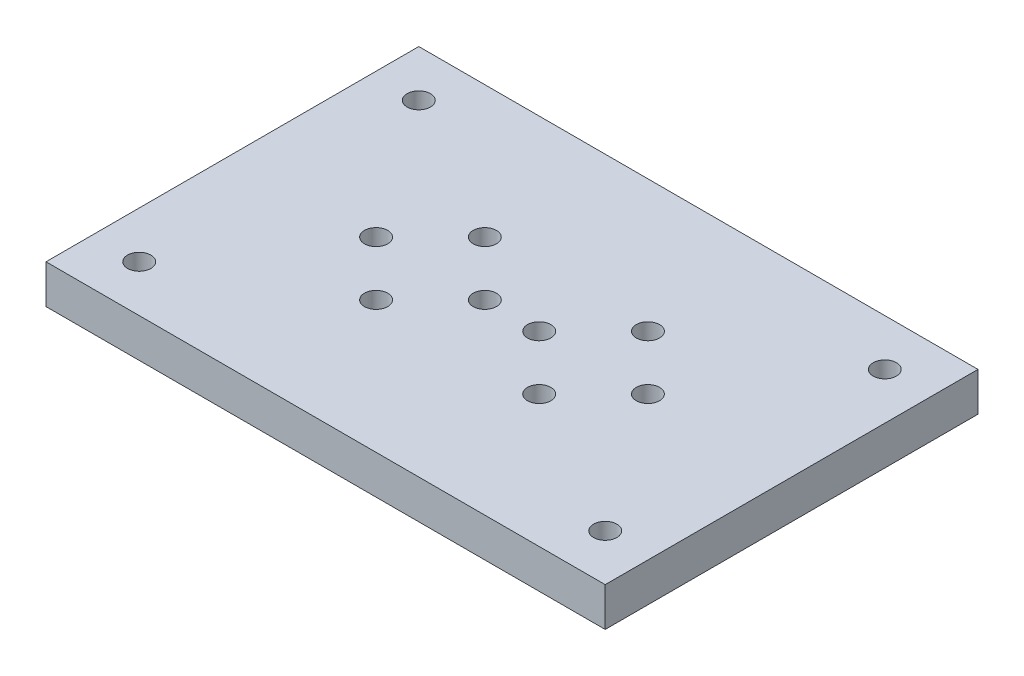
ISO-10303-21;
HEADER;
FILE_DESCRIPTION(('STEP AP214'),'2;1');
FILE_NAME('part.step','',(''),(''),'','','');
FILE_SCHEMA(('AUTOMOTIVE_DESIGN { 1 0 10303 214 1 1 1 1 }'));
ENDSEC;
DATA;
#1=APPLICATION_CONTEXT('core data for automotive mechanical design processes');
#2=APPLICATION_PROTOCOL_DEFINITION('international standard','automotive_design',2000,#1);
#3=PRODUCT_CONTEXT('',#1,'mechanical');
#4=PRODUCT('Part','Part','',(#3));
#5=PRODUCT_RELATED_PRODUCT_CATEGORY('part','',(#4));
#6=PRODUCT_DEFINITION_FORMATION('','',#4);
#7=PRODUCT_DEFINITION_CONTEXT('part definition',#1,'design');
#8=PRODUCT_DEFINITION('design','',#6,#7);
#9=PRODUCT_DEFINITION_SHAPE('','',#8);
#10=(LENGTH_UNIT() NAMED_UNIT(*) SI_UNIT(.MILLI.,.METRE.));
#11=(NAMED_UNIT(*) PLANE_ANGLE_UNIT() SI_UNIT($,.RADIAN.));
#12=(NAMED_UNIT(*) SI_UNIT($,.STERADIAN.) SOLID_ANGLE_UNIT());
#13=UNCERTAINTY_MEASURE_WITH_UNIT(LENGTH_MEASURE(1.E-05),#10,'distance_accuracy_value','');
#14=(GEOMETRIC_REPRESENTATION_CONTEXT(3) GLOBAL_UNCERTAINTY_ASSIGNED_CONTEXT((#13)) GLOBAL_UNIT_ASSIGNED_CONTEXT((#10,
#11,#12)) REPRESENTATION_CONTEXT('',''));
#15=CARTESIAN_POINT('',(0.,0.,0.));
#16=DIRECTION('',(0.,0.,1.));
#17=DIRECTION('',(1.,0.,0.));
#18=AXIS2_PLACEMENT_3D('',#15,#16,#17);
#19=CARTESIAN_POINT('',(0.,5.,0.));
#20=DIRECTION('',(0.,-1.,0.));
#21=DIRECTION('',(0.,0.,-1.));
#22=AXIS2_PLACEMENT_3D('',#19,#20,#21);
#23=PLANE('',#22);
#24=DIRECTION('',(0.,0.,-1.));
#25=VECTOR('',#24,1.);
#26=CARTESIAN_POINT('',(36.,5.,24.));
#27=LINE('',#26,#25);
#28=CARTESIAN_POINT('',(36.,5.,24.));
#29=VERTEX_POINT('',#28);
#30=CARTESIAN_POINT('',(36.,5.,-24.));
#31=VERTEX_POINT('',#30);
#32=EDGE_CURVE('E89',#29,#31,#27,.T.);
#33=ORIENTED_EDGE('',*,*,#32,.T.);
#34=DIRECTION('',(-1.,0.,0.));
#35=VECTOR('',#34,1.);
#36=CARTESIAN_POINT('',(-36.,5.,-24.));
#37=LINE('',#36,#35);
#38=CARTESIAN_POINT('',(-36.,5.,-24.));
#39=VERTEX_POINT('',#38);
#40=EDGE_CURVE('E84',#31,#39,#37,.T.);
#41=ORIENTED_EDGE('',*,*,#40,.T.);
#42=DIRECTION('',(0.,0.,1.));
#43=VECTOR('',#42,1.);
#44=CARTESIAN_POINT('',(-36.,5.,24.));
#45=LINE('',#44,#43);
#46=CARTESIAN_POINT('',(-36.,5.,24.));
#47=VERTEX_POINT('',#46);
#48=EDGE_CURVE('E87',#39,#47,#45,.T.);
#49=ORIENTED_EDGE('',*,*,#48,.T.);
#50=DIRECTION('',(1.,0.,0.));
#51=VECTOR('',#50,1.);
#52=CARTESIAN_POINT('',(-36.,5.,24.));
#53=LINE('',#52,#51);
#54=EDGE_CURVE('E54',#47,#29,#53,.T.);
#55=ORIENTED_EDGE('',*,*,#54,.T.);
#56=EDGE_LOOP('',(#33,#41,#49,#55));
#57=FACE_BOUND('',#56,.T.);
#58=CARTESIAN_POINT('',(-17.5,5.,0.));
#59=DIRECTION('',(0.,1.,0.));
#60=DIRECTION('',(0.,0.,1.));
#61=AXIS2_PLACEMENT_3D('',#58,#59,#60);
#62=CIRCLE('',#61,1.5);
#63=CARTESIAN_POINT('',(-17.5,5.,1.5));
#64=VERTEX_POINT('',#63);
#65=EDGE_CURVE('E104',#64,#64,#62,.T.);
#66=ORIENTED_EDGE('',*,*,#65,.F.);
#67=EDGE_LOOP('',(#66));
#68=FACE_BOUND('',#67,.T.);
#69=CARTESIAN_POINT('',(-30.,5.,18.));
#70=DIRECTION('',(0.,1.,0.));
#71=DIRECTION('',(0.,0.,1.));
#72=AXIS2_PLACEMENT_3D('',#69,#70,#71);
#73=CIRCLE('',#72,1.5);
#74=CARTESIAN_POINT('',(-30.,5.,19.5));
#75=VERTEX_POINT('',#74);
#76=EDGE_CURVE('E119',#75,#75,#73,.T.);
#77=ORIENTED_EDGE('',*,*,#76,.F.);
#78=EDGE_LOOP('',(#77));
#79=FACE_BOUND('',#78,.T.);
#80=CARTESIAN_POINT('',(-10.5,5.,-7.));
#81=DIRECTION('',(0.,1.,0.));
#82=DIRECTION('',(0.,0.,1.));
#83=AXIS2_PLACEMENT_3D('',#80,#81,#82);
#84=CIRCLE('',#83,1.5);
#85=CARTESIAN_POINT('',(-10.5,5.,-5.5));
#86=VERTEX_POINT('',#85);
#87=EDGE_CURVE('E125',#86,#86,#84,.T.);
#88=ORIENTED_EDGE('',*,*,#87,.F.);
#89=EDGE_LOOP('',(#88));
#90=FACE_BOUND('',#89,.T.);
#91=CARTESIAN_POINT('',(-3.5,5.,0.));
#92=DIRECTION('',(0.,1.,0.));
#93=DIRECTION('',(0.,0.,1.));
#94=AXIS2_PLACEMENT_3D('',#91,#92,#93);
#95=CIRCLE('',#94,1.5);
#96=CARTESIAN_POINT('',(-3.5,5.,1.5));
#97=VERTEX_POINT('',#96);
#98=EDGE_CURVE('E131',#97,#97,#95,.T.);
#99=ORIENTED_EDGE('',*,*,#98,.F.);
#100=EDGE_LOOP('',(#99));
#101=FACE_BOUND('',#100,.T.);
#102=CARTESIAN_POINT('',(-10.5,5.,7.));
#103=DIRECTION('',(0.,1.,0.));
#104=DIRECTION('',(0.,0.,1.));
#105=AXIS2_PLACEMENT_3D('',#102,#103,#104);
#106=CIRCLE('',#105,1.5);
#107=CARTESIAN_POINT('',(-10.5,5.,8.49999999999999));
#108=VERTEX_POINT('',#107);
#109=EDGE_CURVE('E137',#108,#108,#106,.T.);
#110=ORIENTED_EDGE('',*,*,#109,.F.);
#111=EDGE_LOOP('',(#110));
#112=FACE_BOUND('',#111,.T.);
#113=CARTESIAN_POINT('',(-30.,5.,-18.));
#114=DIRECTION('',(0.,1.,0.));
#115=DIRECTION('',(0.,0.,1.));
#116=AXIS2_PLACEMENT_3D('',#113,#114,#115);
#117=CIRCLE('',#116,1.5);
#118=CARTESIAN_POINT('',(-30.,5.,-16.5));
#119=VERTEX_POINT('',#118);
#120=EDGE_CURVE('E143',#119,#119,#117,.T.);
#121=ORIENTED_EDGE('',*,*,#120,.F.);
#122=EDGE_LOOP('',(#121));
#123=FACE_BOUND('',#122,.T.);
#124=CARTESIAN_POINT('',(10.5,5.,-7.));
#125=DIRECTION('',(0.,1.,0.));
#126=DIRECTION('',(0.,0.,-1.));
#127=AXIS2_PLACEMENT_3D('',#124,#125,#126);
#128=CIRCLE('',#127,1.5);
#129=CARTESIAN_POINT('',(10.5,5.,-8.49999999999999));
#130=VERTEX_POINT('',#129);
#131=EDGE_CURVE('E149',#130,#130,#128,.T.);
#132=ORIENTED_EDGE('',*,*,#131,.F.);
#133=EDGE_LOOP('',(#132));
#134=FACE_BOUND('',#133,.T.);
#135=CARTESIAN_POINT('',(3.5,5.,0.));
#136=DIRECTION('',(0.,1.,0.));
#137=DIRECTION('',(0.,0.,-1.));
#138=AXIS2_PLACEMENT_3D('',#135,#136,#137);
#139=CIRCLE('',#138,1.5);
#140=CARTESIAN_POINT('',(3.5,5.,-1.5));
#141=VERTEX_POINT('',#140);
#142=EDGE_CURVE('E155',#141,#141,#139,.T.);
#143=ORIENTED_EDGE('',*,*,#142,.F.);
#144=EDGE_LOOP('',(#143));
#145=FACE_BOUND('',#144,.T.);
#146=CARTESIAN_POINT('',(10.5,5.,7.));
#147=DIRECTION('',(0.,1.,0.));
#148=DIRECTION('',(0.,0.,-1.));
#149=AXIS2_PLACEMENT_3D('',#146,#147,#148);
#150=CIRCLE('',#149,1.5);
#151=CARTESIAN_POINT('',(10.5,5.,5.5));
#152=VERTEX_POINT('',#151);
#153=EDGE_CURVE('E161',#152,#152,#150,.T.);
#154=ORIENTED_EDGE('',*,*,#153,.F.);
#155=EDGE_LOOP('',(#154));
#156=FACE_BOUND('',#155,.T.);
#157=CARTESIAN_POINT('',(17.5,5.,0.));
#158=DIRECTION('',(0.,1.,0.));
#159=DIRECTION('',(0.,0.,-1.));
#160=AXIS2_PLACEMENT_3D('',#157,#158,#159);
#161=CIRCLE('',#160,1.5);
#162=CARTESIAN_POINT('',(17.5,5.,-1.5));
#163=VERTEX_POINT('',#162);
#164=EDGE_CURVE('E167',#163,#163,#161,.T.);
#165=ORIENTED_EDGE('',*,*,#164,.F.);
#166=EDGE_LOOP('',(#165));
#167=FACE_BOUND('',#166,.T.);
#168=CARTESIAN_POINT('',(30.,5.,-18.));
#169=DIRECTION('',(0.,1.,0.));
#170=DIRECTION('',(0.,0.,-1.));
#171=AXIS2_PLACEMENT_3D('',#168,#169,#170);
#172=CIRCLE('',#171,1.5);
#173=CARTESIAN_POINT('',(30.,5.,-19.5));
#174=VERTEX_POINT('',#173);
#175=EDGE_CURVE('E173',#174,#174,#172,.T.);
#176=ORIENTED_EDGE('',*,*,#175,.F.);
#177=EDGE_LOOP('',(#176));
#178=FACE_BOUND('',#177,.T.);
#179=CARTESIAN_POINT('',(30.,5.,18.));
#180=DIRECTION('',(0.,1.,0.));
#181=DIRECTION('',(0.,0.,-1.));
#182=AXIS2_PLACEMENT_3D('',#179,#180,#181);
#183=CIRCLE('',#182,1.5);
#184=CARTESIAN_POINT('',(30.,5.,16.5));
#185=VERTEX_POINT('',#184);
#186=EDGE_CURVE('E179',#185,#185,#183,.T.);
#187=ORIENTED_EDGE('',*,*,#186,.F.);
#188=EDGE_LOOP('',(#187));
#189=FACE_BOUND('',#188,.T.);
#190=ADVANCED_FACE('F37',(#57,#68,#79,#90,#101,#112,#123,#134,#145,#156,#167,#178,#189),#23,.F.);
#191=CARTESIAN_POINT('',(0.,0.,0.));
#192=DIRECTION('',(0.,-1.,0.));
#193=DIRECTION('',(0.,0.,-1.));
#194=AXIS2_PLACEMENT_3D('',#191,#192,#193);
#195=PLANE('',#194);
#196=CARTESIAN_POINT('',(30.,0.,-18.));
#197=DIRECTION('',(0.,1.,0.));
#198=DIRECTION('',(0.,0.,-1.));
#199=AXIS2_PLACEMENT_3D('',#196,#197,#198);
#200=CIRCLE('',#199,1.5);
#201=CARTESIAN_POINT('',(30.,0.,-19.5));
#202=VERTEX_POINT('',#201);
#203=EDGE_CURVE('E176',#202,#202,#200,.T.);
#204=ORIENTED_EDGE('',*,*,#203,.T.);
#205=EDGE_LOOP('',(#204));
#206=FACE_BOUND('',#205,.T.);
#207=CARTESIAN_POINT('',(10.5,0.,7.));
#208=DIRECTION('',(0.,1.,0.));
#209=DIRECTION('',(0.,0.,-1.));
#210=AXIS2_PLACEMENT_3D('',#207,#208,#209);
#211=CIRCLE('',#210,1.5);
#212=CARTESIAN_POINT('',(10.5,0.,5.5));
#213=VERTEX_POINT('',#212);
#214=EDGE_CURVE('E164',#213,#213,#211,.T.);
#215=ORIENTED_EDGE('',*,*,#214,.T.);
#216=EDGE_LOOP('',(#215));
#217=FACE_BOUND('',#216,.T.);
#218=CARTESIAN_POINT('',(10.5,0.,-7.));
#219=DIRECTION('',(0.,1.,0.));
#220=DIRECTION('',(0.,0.,-1.));
#221=AXIS2_PLACEMENT_3D('',#218,#219,#220);
#222=CIRCLE('',#221,1.5);
#223=CARTESIAN_POINT('',(10.5,0.,-8.49999999999999));
#224=VERTEX_POINT('',#223);
#225=EDGE_CURVE('E152',#224,#224,#222,.T.);
#226=ORIENTED_EDGE('',*,*,#225,.T.);
#227=EDGE_LOOP('',(#226));
#228=FACE_BOUND('',#227,.T.);
#229=CARTESIAN_POINT('',(-10.5,0.,7.));
#230=DIRECTION('',(0.,1.,0.));
#231=DIRECTION('',(0.,0.,1.));
#232=AXIS2_PLACEMENT_3D('',#229,#230,#231);
#233=CIRCLE('',#232,1.5);
#234=CARTESIAN_POINT('',(-10.5,0.,8.49999999999999));
#235=VERTEX_POINT('',#234);
#236=EDGE_CURVE('E140',#235,#235,#233,.T.);
#237=ORIENTED_EDGE('',*,*,#236,.T.);
#238=EDGE_LOOP('',(#237));
#239=FACE_BOUND('',#238,.T.);
#240=CARTESIAN_POINT('',(-10.5,0.,-7.));
#241=DIRECTION('',(0.,1.,0.));
#242=DIRECTION('',(0.,0.,1.));
#243=AXIS2_PLACEMENT_3D('',#240,#241,#242);
#244=CIRCLE('',#243,1.5);
#245=CARTESIAN_POINT('',(-10.5,0.,-5.5));
#246=VERTEX_POINT('',#245);
#247=EDGE_CURVE('E128',#246,#246,#244,.T.);
#248=ORIENTED_EDGE('',*,*,#247,.T.);
#249=EDGE_LOOP('',(#248));
#250=FACE_BOUND('',#249,.T.);
#251=CARTESIAN_POINT('',(-17.5,0.,0.));
#252=DIRECTION('',(0.,1.,0.));
#253=DIRECTION('',(0.,0.,1.));
#254=AXIS2_PLACEMENT_3D('',#251,#252,#253);
#255=CIRCLE('',#254,1.5);
#256=CARTESIAN_POINT('',(-17.5,0.,1.5));
#257=VERTEX_POINT('',#256);
#258=EDGE_CURVE('E116',#257,#257,#255,.T.);
#259=ORIENTED_EDGE('',*,*,#258,.T.);
#260=EDGE_LOOP('',(#259));
#261=FACE_BOUND('',#260,.T.);
#262=DIRECTION('',(0.,0.,-1.));
#263=VECTOR('',#262,1.);
#264=CARTESIAN_POINT('',(36.,0.,24.));
#265=LINE('',#264,#263);
#266=CARTESIAN_POINT('',(36.,0.,24.));
#267=VERTEX_POINT('',#266);
#268=CARTESIAN_POINT('',(36.,0.,-24.));
#269=VERTEX_POINT('',#268);
#270=EDGE_CURVE('E101',#267,#269,#265,.T.);
#271=ORIENTED_EDGE('',*,*,#270,.F.);
#272=DIRECTION('',(1.,0.,0.));
#273=VECTOR('',#272,1.);
#274=CARTESIAN_POINT('',(-36.,0.,24.));
#275=LINE('',#274,#273);
#276=CARTESIAN_POINT('',(-36.,0.,24.));
#277=VERTEX_POINT('',#276);
#278=EDGE_CURVE('E77',#277,#267,#275,.T.);
#279=ORIENTED_EDGE('',*,*,#278,.F.);
#280=DIRECTION('',(0.,0.,1.));
#281=VECTOR('',#280,1.);
#282=CARTESIAN_POINT('',(-36.,0.,24.));
#283=LINE('',#282,#281);
#284=CARTESIAN_POINT('',(-36.,0.,-24.));
#285=VERTEX_POINT('',#284);
#286=EDGE_CURVE('E71',#285,#277,#283,.T.);
#287=ORIENTED_EDGE('',*,*,#286,.F.);
#288=DIRECTION('',(-1.,0.,0.));
#289=VECTOR('',#288,1.);
#290=CARTESIAN_POINT('',(-36.,0.,-24.));
#291=LINE('',#290,#289);
#292=EDGE_CURVE('E93',#269,#285,#291,.T.);
#293=ORIENTED_EDGE('',*,*,#292,.F.);
#294=EDGE_LOOP('',(#271,#279,#287,#293));
#295=FACE_BOUND('',#294,.T.);
#296=CARTESIAN_POINT('',(-30.,0.,18.));
#297=DIRECTION('',(0.,1.,0.));
#298=DIRECTION('',(0.,0.,1.));
#299=AXIS2_PLACEMENT_3D('',#296,#297,#298);
#300=CIRCLE('',#299,1.5);
#301=CARTESIAN_POINT('',(-30.,0.,19.5));
#302=VERTEX_POINT('',#301);
#303=EDGE_CURVE('E122',#302,#302,#300,.T.);
#304=ORIENTED_EDGE('',*,*,#303,.T.);
#305=EDGE_LOOP('',(#304));
#306=FACE_BOUND('',#305,.T.);
#307=CARTESIAN_POINT('',(-3.5,0.,0.));
#308=DIRECTION('',(0.,1.,0.));
#309=DIRECTION('',(0.,0.,1.));
#310=AXIS2_PLACEMENT_3D('',#307,#308,#309);
#311=CIRCLE('',#310,1.5);
#312=CARTESIAN_POINT('',(-3.5,0.,1.5));
#313=VERTEX_POINT('',#312);
#314=EDGE_CURVE('E134',#313,#313,#311,.T.);
#315=ORIENTED_EDGE('',*,*,#314,.T.);
#316=EDGE_LOOP('',(#315));
#317=FACE_BOUND('',#316,.T.);
#318=CARTESIAN_POINT('',(-30.,0.,-18.));
#319=DIRECTION('',(0.,1.,0.));
#320=DIRECTION('',(0.,0.,1.));
#321=AXIS2_PLACEMENT_3D('',#318,#319,#320);
#322=CIRCLE('',#321,1.5);
#323=CARTESIAN_POINT('',(-30.,0.,-16.5));
#324=VERTEX_POINT('',#323);
#325=EDGE_CURVE('E146',#324,#324,#322,.T.);
#326=ORIENTED_EDGE('',*,*,#325,.T.);
#327=EDGE_LOOP('',(#326));
#328=FACE_BOUND('',#327,.T.);
#329=CARTESIAN_POINT('',(3.5,0.,0.));
#330=DIRECTION('',(0.,1.,0.));
#331=DIRECTION('',(0.,0.,-1.));
#332=AXIS2_PLACEMENT_3D('',#329,#330,#331);
#333=CIRCLE('',#332,1.5);
#334=CARTESIAN_POINT('',(3.5,0.,-1.5));
#335=VERTEX_POINT('',#334);
#336=EDGE_CURVE('E158',#335,#335,#333,.T.);
#337=ORIENTED_EDGE('',*,*,#336,.T.);
#338=EDGE_LOOP('',(#337));
#339=FACE_BOUND('',#338,.T.);
#340=CARTESIAN_POINT('',(17.5,0.,0.));
#341=DIRECTION('',(0.,1.,0.));
#342=DIRECTION('',(0.,0.,-1.));
#343=AXIS2_PLACEMENT_3D('',#340,#341,#342);
#344=CIRCLE('',#343,1.5);
#345=CARTESIAN_POINT('',(17.5,0.,-1.5));
#346=VERTEX_POINT('',#345);
#347=EDGE_CURVE('E170',#346,#346,#344,.T.);
#348=ORIENTED_EDGE('',*,*,#347,.T.);
#349=EDGE_LOOP('',(#348));
#350=FACE_BOUND('',#349,.T.);
#351=CARTESIAN_POINT('',(30.,0.,18.));
#352=DIRECTION('',(0.,1.,0.));
#353=DIRECTION('',(0.,0.,-1.));
#354=AXIS2_PLACEMENT_3D('',#351,#352,#353);
#355=CIRCLE('',#354,1.5);
#356=CARTESIAN_POINT('',(30.,0.,16.5));
#357=VERTEX_POINT('',#356);
#358=EDGE_CURVE('E182',#357,#357,#355,.T.);
#359=ORIENTED_EDGE('',*,*,#358,.T.);
#360=EDGE_LOOP('',(#359));
#361=FACE_BOUND('',#360,.T.);
#362=ADVANCED_FACE('F112',(#206,#217,#228,#239,#250,#261,#295,#306,#317,#328,#339,#350,#361),
#195,.T.);
#363=CARTESIAN_POINT('',(36.,5.,24.));
#364=DIRECTION('',(-1.,0.,0.));
#365=DIRECTION('',(0.,0.,1.));
#366=AXIS2_PLACEMENT_3D('',#363,#364,#365);
#367=PLANE('',#366);
#368=ORIENTED_EDGE('',*,*,#270,.T.);
#369=DIRECTION('',(0.,-1.,0.));
#370=VECTOR('',#369,1.);
#371=CARTESIAN_POINT('',(36.,5.,-24.));
#372=LINE('',#371,#370);
#373=EDGE_CURVE('E11',#31,#269,#372,.T.);
#374=ORIENTED_EDGE('',*,*,#373,.F.);
#375=ORIENTED_EDGE('',*,*,#32,.F.);
#376=DIRECTION('',(0.,-1.,0.));
#377=VECTOR('',#376,1.);
#378=CARTESIAN_POINT('',(36.,5.,24.));
#379=LINE('',#378,#377);
#380=EDGE_CURVE('E97',#29,#267,#379,.T.);
#381=ORIENTED_EDGE('',*,*,#380,.T.);
#382=EDGE_LOOP('',(#368,#374,#375,#381));
#383=FACE_BOUND('',#382,.T.);
#384=ADVANCED_FACE('F39',(#383),#367,.F.);
#385=CARTESIAN_POINT('',(-36.,5.,-24.));
#386=DIRECTION('',(0.,0.,1.));
#387=DIRECTION('',(1.,0.,0.));
#388=AXIS2_PLACEMENT_3D('',#385,#386,#387);
#389=PLANE('',#388);
#390=ORIENTED_EDGE('',*,*,#292,.T.);
#391=DIRECTION('',(0.,-1.,0.));
#392=VECTOR('',#391,1.);
#393=CARTESIAN_POINT('',(-36.,5.,-24.));
#394=LINE('',#393,#392);
#395=EDGE_CURVE('E46',#39,#285,#394,.T.);
#396=ORIENTED_EDGE('',*,*,#395,.F.);
#397=ORIENTED_EDGE('',*,*,#40,.F.);
#398=ORIENTED_EDGE('',*,*,#373,.T.);
#399=EDGE_LOOP('',(#390,#396,#397,#398));
#400=FACE_BOUND('',#399,.T.);
#401=ADVANCED_FACE('F92',(#400),#389,.F.);
#402=CARTESIAN_POINT('',(-36.,5.,24.));
#403=DIRECTION('',(1.,0.,0.));
#404=DIRECTION('',(0.,0.,-1.));
#405=AXIS2_PLACEMENT_3D('',#402,#403,#404);
#406=PLANE('',#405);
#407=ORIENTED_EDGE('',*,*,#286,.T.);
#408=DIRECTION('',(0.,-1.,0.));
#409=VECTOR('',#408,1.);
#410=CARTESIAN_POINT('',(-36.,5.,24.));
#411=LINE('',#410,#409);
#412=EDGE_CURVE('E94',#47,#277,#411,.T.);
#413=ORIENTED_EDGE('',*,*,#412,.F.);
#414=ORIENTED_EDGE('',*,*,#48,.F.);
#415=ORIENTED_EDGE('',*,*,#395,.T.);
#416=EDGE_LOOP('',(#407,#413,#414,#415));
#417=FACE_BOUND('',#416,.T.);
#418=ADVANCED_FACE('F95',(#417),#406,.F.);
#419=CARTESIAN_POINT('',(-36.,5.,24.));
#420=DIRECTION('',(0.,0.,-1.));
#421=DIRECTION('',(-1.,0.,0.));
#422=AXIS2_PLACEMENT_3D('',#419,#420,#421);
#423=PLANE('',#422);
#424=ORIENTED_EDGE('',*,*,#278,.T.);
#425=ORIENTED_EDGE('',*,*,#380,.F.);
#426=ORIENTED_EDGE('',*,*,#54,.F.);
#427=ORIENTED_EDGE('',*,*,#412,.T.);
#428=EDGE_LOOP('',(#424,#425,#426,#427));
#429=FACE_BOUND('',#428,.T.);
#430=ADVANCED_FACE('F109',(#429),#423,.F.);
#431=CARTESIAN_POINT('',(-17.5,5.,0.));
#432=DIRECTION('',(0.,-1.,0.));
#433=DIRECTION('',(0.,0.,-1.));
#434=AXIS2_PLACEMENT_3D('',#431,#432,#433);
#435=CYLINDRICAL_SURFACE('',#434,1.5);
#436=ORIENTED_EDGE('',*,*,#65,.T.);
#437=EDGE_LOOP('',(#436));
#438=FACE_BOUND('',#437,.T.);
#439=ORIENTED_EDGE('',*,*,#258,.F.);
#440=EDGE_LOOP('',(#439));
#441=FACE_BOUND('',#440,.T.);
#442=ADVANCED_FACE('F199',(#438,#441),#435,.F.);
#443=CARTESIAN_POINT('',(-30.,5.,18.));
#444=DIRECTION('',(0.,-1.,0.));
#445=DIRECTION('',(0.,0.,-1.));
#446=AXIS2_PLACEMENT_3D('',#443,#444,#445);
#447=CYLINDRICAL_SURFACE('',#446,1.5);
#448=ORIENTED_EDGE('',*,*,#76,.T.);
#449=EDGE_LOOP('',(#448));
#450=FACE_BOUND('',#449,.T.);
#451=ORIENTED_EDGE('',*,*,#303,.F.);
#452=EDGE_LOOP('',(#451));
#453=FACE_BOUND('',#452,.T.);
#454=ADVANCED_FACE('F253',(#450,#453),#447,.F.);
#455=CARTESIAN_POINT('',(-10.5,5.,-7.));
#456=DIRECTION('',(0.,-1.,0.));
#457=DIRECTION('',(0.,0.,-1.));
#458=AXIS2_PLACEMENT_3D('',#455,#456,#457);
#459=CYLINDRICAL_SURFACE('',#458,1.5);
#460=ORIENTED_EDGE('',*,*,#87,.T.);
#461=EDGE_LOOP('',(#460));
#462=FACE_BOUND('',#461,.T.);
#463=ORIENTED_EDGE('',*,*,#247,.F.);
#464=EDGE_LOOP('',(#463));
#465=FACE_BOUND('',#464,.T.);
#466=ADVANCED_FACE('F262',(#462,#465),#459,.F.);
#467=CARTESIAN_POINT('',(-3.5,5.,0.));
#468=DIRECTION('',(0.,-1.,0.));
#469=DIRECTION('',(0.,0.,-1.));
#470=AXIS2_PLACEMENT_3D('',#467,#468,#469);
#471=CYLINDRICAL_SURFACE('',#470,1.5);
#472=ORIENTED_EDGE('',*,*,#98,.T.);
#473=EDGE_LOOP('',(#472));
#474=FACE_BOUND('',#473,.T.);
#475=ORIENTED_EDGE('',*,*,#314,.F.);
#476=EDGE_LOOP('',(#475));
#477=FACE_BOUND('',#476,.T.);
#478=ADVANCED_FACE('F271',(#474,#477),#471,.F.);
#479=CARTESIAN_POINT('',(-10.5,5.,7.));
#480=DIRECTION('',(0.,-1.,0.));
#481=DIRECTION('',(0.,0.,-1.));
#482=AXIS2_PLACEMENT_3D('',#479,#480,#481);
#483=CYLINDRICAL_SURFACE('',#482,1.5);
#484=ORIENTED_EDGE('',*,*,#109,.T.);
#485=EDGE_LOOP('',(#484));
#486=FACE_BOUND('',#485,.T.);
#487=ORIENTED_EDGE('',*,*,#236,.F.);
#488=EDGE_LOOP('',(#487));
#489=FACE_BOUND('',#488,.T.);
#490=ADVANCED_FACE('F281',(#486,#489),#483,.F.);
#491=CARTESIAN_POINT('',(-30.,5.,-18.));
#492=DIRECTION('',(0.,-1.,0.));
#493=DIRECTION('',(0.,0.,-1.));
#494=AXIS2_PLACEMENT_3D('',#491,#492,#493);
#495=CYLINDRICAL_SURFACE('',#494,1.5);
#496=ORIENTED_EDGE('',*,*,#120,.T.);
#497=EDGE_LOOP('',(#496));
#498=FACE_BOUND('',#497,.T.);
#499=ORIENTED_EDGE('',*,*,#325,.F.);
#500=EDGE_LOOP('',(#499));
#501=FACE_BOUND('',#500,.T.);
#502=ADVANCED_FACE('F291',(#498,#501),#495,.F.);
#503=CARTESIAN_POINT('',(10.5,5.,-7.));
#504=DIRECTION('',(0.,-1.,0.));
#505=DIRECTION('',(0.,0.,-1.));
#506=AXIS2_PLACEMENT_3D('',#503,#504,#505);
#507=CYLINDRICAL_SURFACE('',#506,1.5);
#508=ORIENTED_EDGE('',*,*,#131,.T.);
#509=EDGE_LOOP('',(#508));
#510=FACE_BOUND('',#509,.T.);
#511=ORIENTED_EDGE('',*,*,#225,.F.);
#512=EDGE_LOOP('',(#511));
#513=FACE_BOUND('',#512,.T.);
#514=ADVANCED_FACE('F301',(#510,#513),#507,.F.);
#515=CARTESIAN_POINT('',(3.5,5.,0.));
#516=DIRECTION('',(0.,-1.,0.));
#517=DIRECTION('',(0.,0.,-1.));
#518=AXIS2_PLACEMENT_3D('',#515,#516,#517);
#519=CYLINDRICAL_SURFACE('',#518,1.5);
#520=ORIENTED_EDGE('',*,*,#142,.T.);
#521=EDGE_LOOP('',(#520));
#522=FACE_BOUND('',#521,.T.);
#523=ORIENTED_EDGE('',*,*,#336,.F.);
#524=EDGE_LOOP('',(#523));
#525=FACE_BOUND('',#524,.T.);
#526=ADVANCED_FACE('F311',(#522,#525),#519,.F.);
#527=CARTESIAN_POINT('',(10.5,5.,7.));
#528=DIRECTION('',(0.,-1.,0.));
#529=DIRECTION('',(0.,0.,-1.));
#530=AXIS2_PLACEMENT_3D('',#527,#528,#529);
#531=CYLINDRICAL_SURFACE('',#530,1.5);
#532=ORIENTED_EDGE('',*,*,#153,.T.);
#533=EDGE_LOOP('',(#532));
#534=FACE_BOUND('',#533,.T.);
#535=ORIENTED_EDGE('',*,*,#214,.F.);
#536=EDGE_LOOP('',(#535));
#537=FACE_BOUND('',#536,.T.);
#538=ADVANCED_FACE('F321',(#534,#537),#531,.F.);
#539=CARTESIAN_POINT('',(17.5,5.,0.));
#540=DIRECTION('',(0.,-1.,0.));
#541=DIRECTION('',(0.,0.,-1.));
#542=AXIS2_PLACEMENT_3D('',#539,#540,#541);
#543=CYLINDRICAL_SURFACE('',#542,1.5);
#544=ORIENTED_EDGE('',*,*,#164,.T.);
#545=EDGE_LOOP('',(#544));
#546=FACE_BOUND('',#545,.T.);
#547=ORIENTED_EDGE('',*,*,#347,.F.);
#548=EDGE_LOOP('',(#547));
#549=FACE_BOUND('',#548,.T.);
#550=ADVANCED_FACE('F331',(#546,#549),#543,.F.);
#551=CARTESIAN_POINT('',(30.,5.,-18.));
#552=DIRECTION('',(0.,-1.,0.));
#553=DIRECTION('',(0.,0.,-1.));
#554=AXIS2_PLACEMENT_3D('',#551,#552,#553);
#555=CYLINDRICAL_SURFACE('',#554,1.5);
#556=ORIENTED_EDGE('',*,*,#175,.T.);
#557=EDGE_LOOP('',(#556));
#558=FACE_BOUND('',#557,.T.);
#559=ORIENTED_EDGE('',*,*,#203,.F.);
#560=EDGE_LOOP('',(#559));
#561=FACE_BOUND('',#560,.T.);
#562=ADVANCED_FACE('F341',(#558,#561),#555,.F.);
#563=CARTESIAN_POINT('',(30.,5.,18.));
#564=DIRECTION('',(0.,-1.,0.));
#565=DIRECTION('',(0.,0.,-1.));
#566=AXIS2_PLACEMENT_3D('',#563,#564,#565);
#567=CYLINDRICAL_SURFACE('',#566,1.5);
#568=ORIENTED_EDGE('',*,*,#186,.T.);
#569=EDGE_LOOP('',(#568));
#570=FACE_BOUND('',#569,.T.);
#571=ORIENTED_EDGE('',*,*,#358,.F.);
#572=EDGE_LOOP('',(#571));
#573=FACE_BOUND('',#572,.T.);
#574=ADVANCED_FACE('F188',(#570,#573),#567,.F.);
#575=CLOSED_SHELL('',(#190,#362,#384,#401,#418,#430,#442,#454,#466,#478,#490,#502,#514,#526,
#538,#550,#562,#574));
#576=MANIFOLD_SOLID_BREP('B2',#575);
#577=ADVANCED_BREP_SHAPE_REPRESENTATION('',(#18,#576),#14);
#578=SHAPE_DEFINITION_REPRESENTATION(#9,#577);
ENDSEC;
END-ISO-10303-21;
